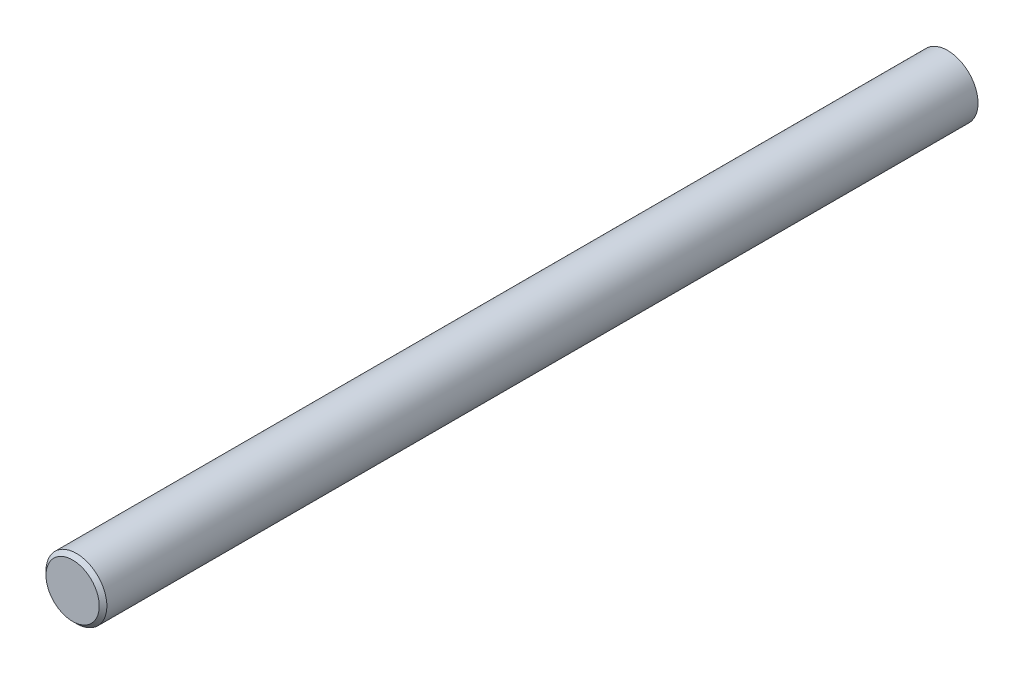
ISO-10303-21;
HEADER;
FILE_DESCRIPTION(('STEP AP214'),'2;1');
FILE_NAME('part.step','',(''),(''),'','','');
FILE_SCHEMA(('AUTOMOTIVE_DESIGN { 1 0 10303 214 1 1 1 1 }'));
ENDSEC;
DATA;
#1=APPLICATION_CONTEXT('core data for automotive mechanical design processes');
#2=APPLICATION_PROTOCOL_DEFINITION('international standard','automotive_design',2000,#1);
#3=PRODUCT_CONTEXT('',#1,'mechanical');
#4=PRODUCT('Part','Part','',(#3));
#5=PRODUCT_RELATED_PRODUCT_CATEGORY('part','',(#4));
#6=PRODUCT_DEFINITION_FORMATION('','',#4);
#7=PRODUCT_DEFINITION_CONTEXT('part definition',#1,'design');
#8=PRODUCT_DEFINITION('design','',#6,#7);
#9=PRODUCT_DEFINITION_SHAPE('','',#8);
#10=(LENGTH_UNIT() NAMED_UNIT(*) SI_UNIT(.MILLI.,.METRE.));
#11=(NAMED_UNIT(*) PLANE_ANGLE_UNIT() SI_UNIT($,.RADIAN.));
#12=(NAMED_UNIT(*) SI_UNIT($,.STERADIAN.) SOLID_ANGLE_UNIT());
#13=UNCERTAINTY_MEASURE_WITH_UNIT(LENGTH_MEASURE(1.E-05),#10,'distance_accuracy_value','');
#14=(GEOMETRIC_REPRESENTATION_CONTEXT(3) GLOBAL_UNCERTAINTY_ASSIGNED_CONTEXT((#13)) GLOBAL_UNIT_ASSIGNED_CONTEXT((#10,
#11,#12)) REPRESENTATION_CONTEXT('',''));
#15=CARTESIAN_POINT('',(0.,0.,0.));
#16=DIRECTION('',(0.,0.,1.));
#17=DIRECTION('',(1.,0.,0.));
#18=AXIS2_PLACEMENT_3D('',#15,#16,#17);
#19=CARTESIAN_POINT('',(-46.9877217872785,68.7900000000009,-44.));
#20=DIRECTION('',(0.,0.,1.));
#21=DIRECTION('',(0.999956682076706,0.009307737111969,0.));
#22=AXIS2_PLACEMENT_3D('',#19,#20,#21);
#23=PLANE('',#22);
#24=CARTESIAN_POINT('',(-46.9877217872785,68.7900000000009,-44.));
#25=DIRECTION('',(0.,0.,-1.));
#26=DIRECTION('',(0.999956682045126,0.00930774050464905,0.));
#27=AXIS2_PLACEMENT_3D('',#24,#25,#26);
#28=CIRCLE('',#27,4.);
#29=CARTESIAN_POINT('',(-50.987548515459,68.7527690379822,-44.));
#30=VERTEX_POINT('',#29);
#31=EDGE_CURVE('E11',#30,#30,#28,.T.);
#32=ORIENTED_EDGE('',*,*,#31,.T.);
#33=EDGE_LOOP('',(#32));
#34=FACE_BOUND('',#33,.T.);
#35=ADVANCED_FACE('F49',(#34),#23,.F.);
#36=CARTESIAN_POINT('',(-46.9877217872784,68.7900000000009,71.));
#37=DIRECTION('',(0.,0.,1.));
#38=DIRECTION('',(0.999956682076706,0.009307737111969,0.));
#39=AXIS2_PLACEMENT_3D('',#36,#37,#38);
#40=PLANE('',#39);
#41=CARTESIAN_POINT('',(-46.9877217872784,68.7900000000009,71.));
#42=DIRECTION('',(0.,0.,-1.));
#43=DIRECTION('',(0.999956682045126,0.00930774050464905,0.));
#44=AXIS2_PLACEMENT_3D('',#41,#42,#43);
#45=CIRCLE('',#44,3.5);
#46=CARTESIAN_POINT('',(-50.4875701744363,68.7574229082345,71.));
#47=VERTEX_POINT('',#46);
#48=EDGE_CURVE('E79',#47,#47,#45,.T.);
#49=ORIENTED_EDGE('',*,*,#48,.F.);
#50=EDGE_LOOP('',(#49));
#51=FACE_BOUND('',#50,.T.);
#52=ADVANCED_FACE('F96',(#51),#40,.T.);
#53=CARTESIAN_POINT('',(-46.9877217872784,68.7900000000009,69.));
#54=DIRECTION('',(0.,0.,1.));
#55=DIRECTION('',(0.999956682045126,0.00930774050464905,0.));
#56=AXIS2_PLACEMENT_3D('',#53,#54,#55);
#57=CYLINDRICAL_SURFACE('',#56,4.);
#58=CARTESIAN_POINT('',(-46.9877217872784,68.7900000000009,70.5));
#59=DIRECTION('',(0.,0.,1.));
#60=DIRECTION('',(0.999956682045126,0.00930774050464905,0.));
#61=AXIS2_PLACEMENT_3D('',#58,#59,#60);
#62=CIRCLE('',#61,4.);
#63=CARTESIAN_POINT('',(-50.9875485154589,68.7527690379822,70.5));
#64=VERTEX_POINT('',#63);
#65=EDGE_CURVE('E81',#64,#64,#62,.T.);
#66=ORIENTED_EDGE('',*,*,#65,.F.);
#67=DIRECTION('',(0.,0.,-1.));
#68=VECTOR('',#67,1.);
#69=CARTESIAN_POINT('',(-50.9875485154589,68.7527690379822,69.));
#70=LINE('',#69,#68);
#71=EDGE_CURVE('E59',#64,#30,#70,.T.);
#72=ORIENTED_EDGE('',*,*,#71,.T.);
#73=ORIENTED_EDGE('',*,*,#31,.F.);
#74=ORIENTED_EDGE('',*,*,#71,.F.);
#75=EDGE_LOOP('',(#66,#72,#73,#74));
#76=FACE_BOUND('',#75,.T.);
#77=ADVANCED_FACE('F51',(#76),#57,.T.);
#78=CARTESIAN_POINT('',(-46.9877217872784,68.7900000000009,70.75));
#79=DIRECTION('',(0.,0.,-1.));
#80=DIRECTION('',(0.999956682045126,0.00930774050464905,0.));
#81=AXIS2_PLACEMENT_3D('',#78,#79,#80);
#82=CONICAL_SURFACE('',#81,3.75,0.785398163397446);
#83=ORIENTED_EDGE('',*,*,#48,.T.);
#84=DIRECTION('',(-0.70707615076691,-0.00658156642836213,-0.707106781186547));
#85=VECTOR('',#84,1.);
#86=CARTESIAN_POINT('',(-50.7375593449476,68.7550959731083,70.75));
#87=LINE('',#86,#85);
#88=EDGE_CURVE('E76',#47,#64,#87,.T.);
#89=ORIENTED_EDGE('',*,*,#88,.T.);
#90=ORIENTED_EDGE('',*,*,#65,.T.);
#91=ORIENTED_EDGE('',*,*,#88,.F.);
#92=EDGE_LOOP('',(#83,#89,#90,#91));
#93=FACE_BOUND('',#92,.T.);
#94=ADVANCED_FACE('F77',(#93),#82,.T.);
#95=CLOSED_SHELL('',(#35,#52,#77,#94));
#96=MANIFOLD_SOLID_BREP('B2',#95);
#97=ADVANCED_BREP_SHAPE_REPRESENTATION('',(#18,#96),#14);
#98=SHAPE_DEFINITION_REPRESENTATION(#9,#97);
ENDSEC;
END-ISO-10303-21;
